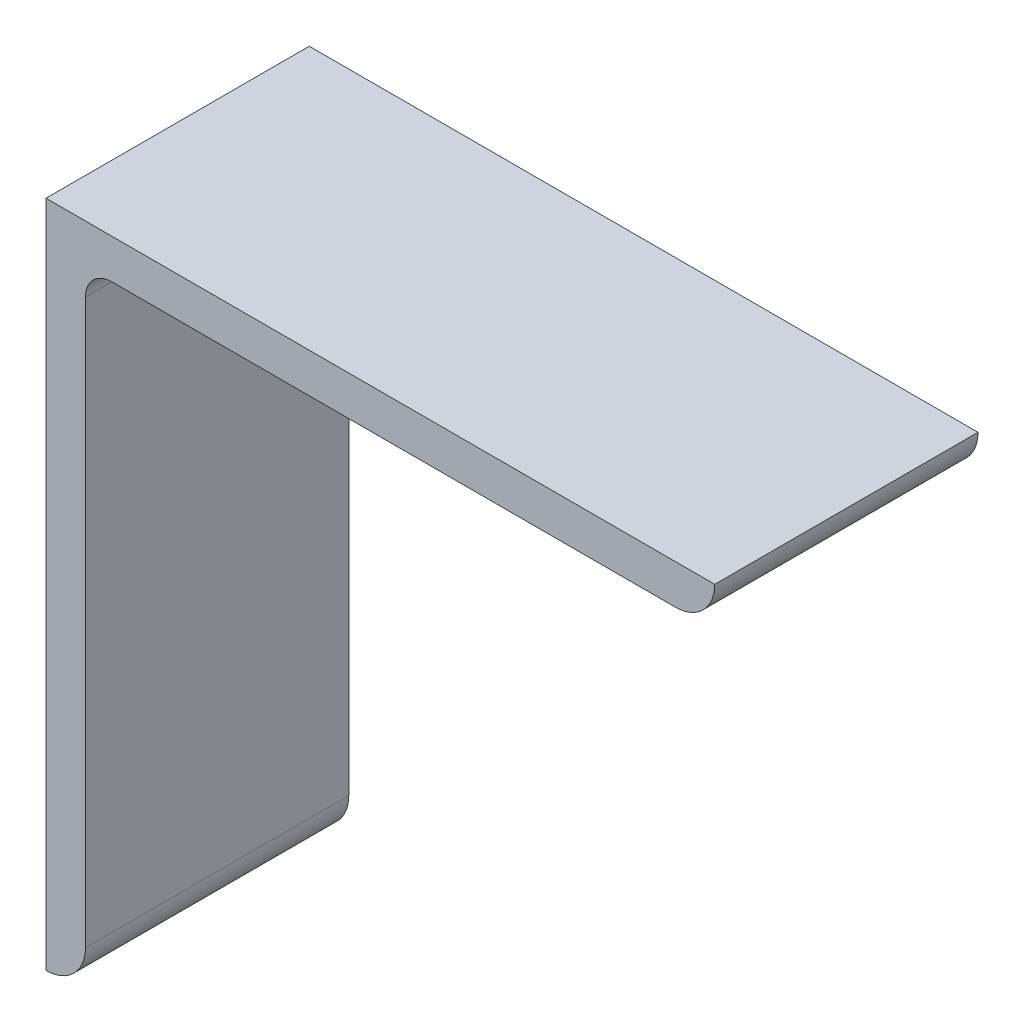
ISO-10303-21;
HEADER;
FILE_DESCRIPTION(('STEP AP214'),'2;1');
FILE_NAME('part.step','',(''),(''),'','','');
FILE_SCHEMA(('AUTOMOTIVE_DESIGN { 1 0 10303 214 1 1 1 1 }'));
ENDSEC;
DATA;
#1=APPLICATION_CONTEXT('core data for automotive mechanical design processes');
#2=APPLICATION_PROTOCOL_DEFINITION('international standard','automotive_design',2000,#1);
#3=PRODUCT_CONTEXT('',#1,'mechanical');
#4=PRODUCT('Part','Part','',(#3));
#5=PRODUCT_RELATED_PRODUCT_CATEGORY('part','',(#4));
#6=PRODUCT_DEFINITION_FORMATION('','',#4);
#7=PRODUCT_DEFINITION_CONTEXT('part definition',#1,'design');
#8=PRODUCT_DEFINITION('design','',#6,#7);
#9=PRODUCT_DEFINITION_SHAPE('','',#8);
#10=(LENGTH_UNIT() NAMED_UNIT(*) SI_UNIT(.MILLI.,.METRE.));
#11=(NAMED_UNIT(*) PLANE_ANGLE_UNIT() SI_UNIT($,.RADIAN.));
#12=(NAMED_UNIT(*) SI_UNIT($,.STERADIAN.) SOLID_ANGLE_UNIT());
#13=UNCERTAINTY_MEASURE_WITH_UNIT(LENGTH_MEASURE(1.E-05),#10,'distance_accuracy_value','');
#14=(GEOMETRIC_REPRESENTATION_CONTEXT(3) GLOBAL_UNCERTAINTY_ASSIGNED_CONTEXT((#13)) GLOBAL_UNIT_ASSIGNED_CONTEXT((#10,
#11,#12)) REPRESENTATION_CONTEXT('',''));
#15=CARTESIAN_POINT('',(0.,0.,0.));
#16=DIRECTION('',(0.,0.,1.));
#17=DIRECTION('',(1.,0.,0.));
#18=AXIS2_PLACEMENT_3D('',#15,#16,#17);
#19=CARTESIAN_POINT('',(-25.5914621457548,-25.5914621457548,20.));
#20=DIRECTION('',(1.,0.,0.));
#21=DIRECTION('',(0.,0.,-1.));
#22=AXIS2_PLACEMENT_3D('',#19,#20,#21);
#23=PLANE('',#22);
#24=DIRECTION('',(0.,-1.,0.));
#25=VECTOR('',#24,1.);
#26=CARTESIAN_POINT('',(-25.5914621457548,-25.5914621457548,0.));
#27=LINE('',#26,#25);
#28=CARTESIAN_POINT('',(-25.5914621457548,25.2085378542452,0.));
#29=VERTEX_POINT('',#28);
#30=CARTESIAN_POINT('',(-25.5914621457548,-25.5914621457548,0.));
#31=VERTEX_POINT('',#30);
#32=EDGE_CURVE('E123',#29,#31,#27,.T.);
#33=ORIENTED_EDGE('',*,*,#32,.T.);
#34=DIRECTION('',(0.,0.,-1.));
#35=VECTOR('',#34,1.);
#36=CARTESIAN_POINT('',(-25.5914621457548,-25.5914621457548,20.));
#37=LINE('',#36,#35);
#38=CARTESIAN_POINT('',(-25.5914621457548,-25.5914621457548,20.));
#39=VERTEX_POINT('',#38);
#40=EDGE_CURVE('E11',#39,#31,#37,.T.);
#41=ORIENTED_EDGE('',*,*,#40,.F.);
#42=DIRECTION('',(0.,-1.,0.));
#43=VECTOR('',#42,1.);
#44=CARTESIAN_POINT('',(-25.5914621457548,-25.5914621457548,20.));
#45=LINE('',#44,#43);
#46=CARTESIAN_POINT('',(-25.5914621457548,25.2085378542452,20.));
#47=VERTEX_POINT('',#46);
#48=EDGE_CURVE('E135',#47,#39,#45,.T.);
#49=ORIENTED_EDGE('',*,*,#48,.F.);
#50=DIRECTION('',(0.,0.,-1.));
#51=VECTOR('',#50,1.);
#52=CARTESIAN_POINT('',(-25.5914621457548,25.2085378542452,20.));
#53=LINE('',#52,#51);
#54=EDGE_CURVE('E119',#47,#29,#53,.T.);
#55=ORIENTED_EDGE('',*,*,#54,.T.);
#56=EDGE_LOOP('',(#33,#41,#49,#55));
#57=FACE_BOUND('',#56,.T.);
#58=ADVANCED_FACE('F33',(#57),#23,.F.);
#59=CARTESIAN_POINT('',(-25.591462145754,-22.5914621457555,20.));
#60=DIRECTION('',(0.,0.,-1.));
#61=DIRECTION('',(-1.,0.,0.));
#62=AXIS2_PLACEMENT_3D('',#59,#60,#61);
#63=CYLINDRICAL_SURFACE('',#62,2.99999999999925);
#64=CARTESIAN_POINT('',(-25.591462145754,-22.5914621457555,0.));
#65=DIRECTION('',(0.,0.,1.));
#66=DIRECTION('',(-1.,0.,0.));
#67=AXIS2_PLACEMENT_3D('',#64,#65,#66);
#68=CIRCLE('',#67,2.99999999999925);
#69=CARTESIAN_POINT('',(-22.5914621457548,-22.5914621457555,0.));
#70=VERTEX_POINT('',#69);
#71=EDGE_CURVE('E126',#31,#70,#68,.T.);
#72=ORIENTED_EDGE('',*,*,#71,.T.);
#73=DIRECTION('',(0.,0.,-1.));
#74=VECTOR('',#73,1.);
#75=CARTESIAN_POINT('',(-22.5914621457548,-22.5914621457555,20.));
#76=LINE('',#75,#74);
#77=CARTESIAN_POINT('',(-22.5914621457548,-22.5914621457555,20.));
#78=VERTEX_POINT('',#77);
#79=EDGE_CURVE('E41',#78,#70,#76,.T.);
#80=ORIENTED_EDGE('',*,*,#79,.F.);
#81=CARTESIAN_POINT('',(-25.591462145754,-22.5914621457555,20.));
#82=DIRECTION('',(0.,0.,1.));
#83=DIRECTION('',(-1.,0.,0.));
#84=AXIS2_PLACEMENT_3D('',#81,#82,#83);
#85=CIRCLE('',#84,2.99999999999925);
#86=EDGE_CURVE('E89',#39,#78,#85,.T.);
#87=ORIENTED_EDGE('',*,*,#86,.F.);
#88=ORIENTED_EDGE('',*,*,#40,.T.);
#89=EDGE_LOOP('',(#72,#80,#87,#88));
#90=FACE_BOUND('',#89,.T.);
#91=ADVANCED_FACE('F160',(#90),#63,.T.);
#92=CARTESIAN_POINT('',(-22.5914621457548,-22.5914621457555,20.));
#93=DIRECTION('',(-1.,0.,0.));
#94=DIRECTION('',(0.,0.,1.));
#95=AXIS2_PLACEMENT_3D('',#92,#93,#94);
#96=PLANE('',#95);
#97=DIRECTION('',(0.,1.,0.));
#98=VECTOR('',#97,1.);
#99=CARTESIAN_POINT('',(-22.5914621457548,-22.5914621457555,0.));
#100=LINE('',#99,#98);
#101=CARTESIAN_POINT('',(-22.5914621457548,20.2085378542452,0.));
#102=VERTEX_POINT('',#101);
#103=EDGE_CURVE('E128',#70,#102,#100,.T.);
#104=ORIENTED_EDGE('',*,*,#103,.T.);
#105=DIRECTION('',(0.,0.,-1.));
#106=VECTOR('',#105,1.);
#107=CARTESIAN_POINT('',(-22.5914621457548,20.2085378542452,20.));
#108=LINE('',#107,#106);
#109=CARTESIAN_POINT('',(-22.5914621457548,20.2085378542452,20.));
#110=VERTEX_POINT('',#109);
#111=EDGE_CURVE('E139',#110,#102,#108,.T.);
#112=ORIENTED_EDGE('',*,*,#111,.F.);
#113=DIRECTION('',(0.,1.,0.));
#114=VECTOR('',#113,1.);
#115=CARTESIAN_POINT('',(-22.5914621457548,-22.5914621457555,20.));
#116=LINE('',#115,#114);
#117=EDGE_CURVE('E147',#78,#110,#116,.T.);
#118=ORIENTED_EDGE('',*,*,#117,.F.);
#119=ORIENTED_EDGE('',*,*,#79,.T.);
#120=EDGE_LOOP('',(#104,#112,#118,#119));
#121=FACE_BOUND('',#120,.T.);
#122=ADVANCED_FACE('F145',(#121),#96,.F.);
#123=CARTESIAN_POINT('',(-20.5914621457548,20.2085378542452,20.));
#124=DIRECTION('',(0.,0.,-1.));
#125=DIRECTION('',(-1.,0.,0.));
#126=AXIS2_PLACEMENT_3D('',#123,#124,#125);
#127=CYLINDRICAL_SURFACE('',#126,2.);
#128=CARTESIAN_POINT('',(-20.5914621457548,20.2085378542452,0.));
#129=DIRECTION('',(0.,0.,-1.));
#130=DIRECTION('',(-1.,0.,0.));
#131=AXIS2_PLACEMENT_3D('',#128,#129,#130);
#132=CIRCLE('',#131,2.);
#133=CARTESIAN_POINT('',(-20.5914621457548,22.2085378542452,0.));
#134=VERTEX_POINT('',#133);
#135=EDGE_CURVE('E130',#102,#134,#132,.T.);
#136=ORIENTED_EDGE('',*,*,#135,.T.);
#137=DIRECTION('',(0.,0.,-1.));
#138=VECTOR('',#137,1.);
#139=CARTESIAN_POINT('',(-20.5914621457548,22.2085378542452,20.));
#140=LINE('',#139,#138);
#141=CARTESIAN_POINT('',(-20.5914621457548,22.2085378542452,20.));
#142=VERTEX_POINT('',#141);
#143=EDGE_CURVE('E114',#142,#134,#140,.T.);
#144=ORIENTED_EDGE('',*,*,#143,.F.);
#145=CARTESIAN_POINT('',(-20.5914621457548,20.2085378542452,20.));
#146=DIRECTION('',(0.,0.,-1.));
#147=DIRECTION('',(-1.,0.,0.));
#148=AXIS2_PLACEMENT_3D('',#145,#146,#147);
#149=CIRCLE('',#148,2.);
#150=EDGE_CURVE('E105',#110,#142,#149,.T.);
#151=ORIENTED_EDGE('',*,*,#150,.F.);
#152=ORIENTED_EDGE('',*,*,#111,.T.);
#153=EDGE_LOOP('',(#136,#144,#151,#152));
#154=FACE_BOUND('',#153,.T.);
#155=ADVANCED_FACE('F153',(#154),#127,.F.);
#156=CARTESIAN_POINT('',(22.2085378542398,22.2085378542452,20.));
#157=DIRECTION('',(0.,1.,0.));
#158=DIRECTION('',(-1.,0.,0.));
#159=AXIS2_PLACEMENT_3D('',#156,#157,#158);
#160=PLANE('',#159);
#161=DIRECTION('',(1.,0.,0.));
#162=VECTOR('',#161,1.);
#163=CARTESIAN_POINT('',(22.2085378542398,22.2085378542452,0.));
#164=LINE('',#163,#162);
#165=CARTESIAN_POINT('',(22.2085378542398,22.2085378542452,0.));
#166=VERTEX_POINT('',#165);
#167=EDGE_CURVE('E113',#134,#166,#164,.T.);
#168=ORIENTED_EDGE('',*,*,#167,.T.);
#169=DIRECTION('',(0.,0.,-1.));
#170=VECTOR('',#169,1.);
#171=CARTESIAN_POINT('',(22.2085378542398,22.2085378542452,20.));
#172=LINE('',#171,#170);
#173=CARTESIAN_POINT('',(22.2085378542398,22.2085378542452,20.));
#174=VERTEX_POINT('',#173);
#175=EDGE_CURVE('E110',#174,#166,#172,.T.);
#176=ORIENTED_EDGE('',*,*,#175,.F.);
#177=DIRECTION('',(1.,0.,0.));
#178=VECTOR('',#177,1.);
#179=CARTESIAN_POINT('',(22.2085378542398,22.2085378542452,20.));
#180=LINE('',#179,#178);
#181=EDGE_CURVE('E99',#142,#174,#180,.T.);
#182=ORIENTED_EDGE('',*,*,#181,.F.);
#183=ORIENTED_EDGE('',*,*,#143,.T.);
#184=EDGE_LOOP('',(#168,#176,#182,#183));
#185=FACE_BOUND('',#184,.T.);
#186=ADVANCED_FACE('F111',(#185),#160,.F.);
#187=CARTESIAN_POINT('',(22.2085378542398,25.2085378542506,20.));
#188=DIRECTION('',(0.,0.,-1.));
#189=DIRECTION('',(-1.,0.,0.));
#190=AXIS2_PLACEMENT_3D('',#187,#188,#189);
#191=CYLINDRICAL_SURFACE('',#190,3.00000000000538);
#192=CARTESIAN_POINT('',(22.2085378542398,25.2085378542506,0.));
#193=DIRECTION('',(0.,0.,1.));
#194=DIRECTION('',(-1.,0.,0.));
#195=AXIS2_PLACEMENT_3D('',#192,#193,#194);
#196=CIRCLE('',#195,3.00000000000538);
#197=CARTESIAN_POINT('',(25.2085378542452,25.2085378542452,0.));
#198=VERTEX_POINT('',#197);
#199=EDGE_CURVE('E75',#166,#198,#196,.T.);
#200=ORIENTED_EDGE('',*,*,#199,.T.);
#201=DIRECTION('',(0.,0.,-1.));
#202=VECTOR('',#201,1.);
#203=CARTESIAN_POINT('',(25.2085378542452,25.2085378542452,20.));
#204=LINE('',#203,#202);
#205=CARTESIAN_POINT('',(25.2085378542452,25.2085378542452,20.));
#206=VERTEX_POINT('',#205);
#207=EDGE_CURVE('E115',#206,#198,#204,.T.);
#208=ORIENTED_EDGE('',*,*,#207,.F.);
#209=CARTESIAN_POINT('',(22.2085378542398,25.2085378542506,20.));
#210=DIRECTION('',(0.,0.,1.));
#211=DIRECTION('',(-1.,0.,0.));
#212=AXIS2_PLACEMENT_3D('',#209,#210,#211);
#213=CIRCLE('',#212,3.00000000000538);
#214=EDGE_CURVE('E103',#174,#206,#213,.T.);
#215=ORIENTED_EDGE('',*,*,#214,.F.);
#216=ORIENTED_EDGE('',*,*,#175,.T.);
#217=EDGE_LOOP('',(#200,#208,#215,#216));
#218=FACE_BOUND('',#217,.T.);
#219=ADVANCED_FACE('F117',(#218),#191,.T.);
#220=CARTESIAN_POINT('',(25.2085378542452,25.2085378542452,20.));
#221=DIRECTION('',(0.,-1.,0.));
#222=DIRECTION('',(1.,0.,0.));
#223=AXIS2_PLACEMENT_3D('',#220,#221,#222);
#224=PLANE('',#223);
#225=DIRECTION('',(-1.,0.,0.));
#226=VECTOR('',#225,1.);
#227=CARTESIAN_POINT('',(25.2085378542452,25.2085378542452,0.));
#228=LINE('',#227,#226);
#229=EDGE_CURVE('E81',#198,#29,#228,.T.);
#230=ORIENTED_EDGE('',*,*,#229,.T.);
#231=ORIENTED_EDGE('',*,*,#54,.F.);
#232=DIRECTION('',(-1.,0.,0.));
#233=VECTOR('',#232,1.);
#234=CARTESIAN_POINT('',(25.2085378542452,25.2085378542452,20.));
#235=LINE('',#234,#233);
#236=EDGE_CURVE('E49',#206,#47,#235,.T.);
#237=ORIENTED_EDGE('',*,*,#236,.F.);
#238=ORIENTED_EDGE('',*,*,#207,.T.);
#239=EDGE_LOOP('',(#230,#231,#237,#238));
#240=FACE_BOUND('',#239,.T.);
#241=ADVANCED_FACE('F174',(#240),#224,.F.);
#242=CARTESIAN_POINT('',(22.2085378542398,25.2085378542506,20.));
#243=DIRECTION('',(0.,0.,-1.));
#244=DIRECTION('',(-1.,0.,0.));
#245=AXIS2_PLACEMENT_3D('',#242,#243,#244);
#246=PLANE('',#245);
#247=ORIENTED_EDGE('',*,*,#48,.T.);
#248=ORIENTED_EDGE('',*,*,#86,.T.);
#249=ORIENTED_EDGE('',*,*,#117,.T.);
#250=ORIENTED_EDGE('',*,*,#150,.T.);
#251=ORIENTED_EDGE('',*,*,#181,.T.);
#252=ORIENTED_EDGE('',*,*,#214,.T.);
#253=ORIENTED_EDGE('',*,*,#236,.T.);
#254=EDGE_LOOP('',(#247,#248,#249,#250,#251,#252,#253));
#255=FACE_BOUND('',#254,.T.);
#256=ADVANCED_FACE('F101',(#255),#246,.F.);
#257=CARTESIAN_POINT('',(22.2085378542398,25.2085378542506,0.));
#258=DIRECTION('',(0.,0.,-1.));
#259=DIRECTION('',(-1.,0.,0.));
#260=AXIS2_PLACEMENT_3D('',#257,#258,#259);
#261=PLANE('',#260);
#262=ORIENTED_EDGE('',*,*,#32,.F.);
#263=ORIENTED_EDGE('',*,*,#229,.F.);
#264=ORIENTED_EDGE('',*,*,#199,.F.);
#265=ORIENTED_EDGE('',*,*,#167,.F.);
#266=ORIENTED_EDGE('',*,*,#135,.F.);
#267=ORIENTED_EDGE('',*,*,#103,.F.);
#268=ORIENTED_EDGE('',*,*,#71,.F.);
#269=EDGE_LOOP('',(#262,#263,#264,#265,#266,#267,#268));
#270=FACE_BOUND('',#269,.T.);
#271=ADVANCED_FACE('F151',(#270),#261,.T.);
#272=CLOSED_SHELL('',(#58,#91,#122,#155,#186,#219,#241,#256,#271));
#273=MANIFOLD_SOLID_BREP('B2',#272);
#274=ADVANCED_BREP_SHAPE_REPRESENTATION('',(#18,#273),#14);
#275=SHAPE_DEFINITION_REPRESENTATION(#9,#274);
ENDSEC;
END-ISO-10303-21;
